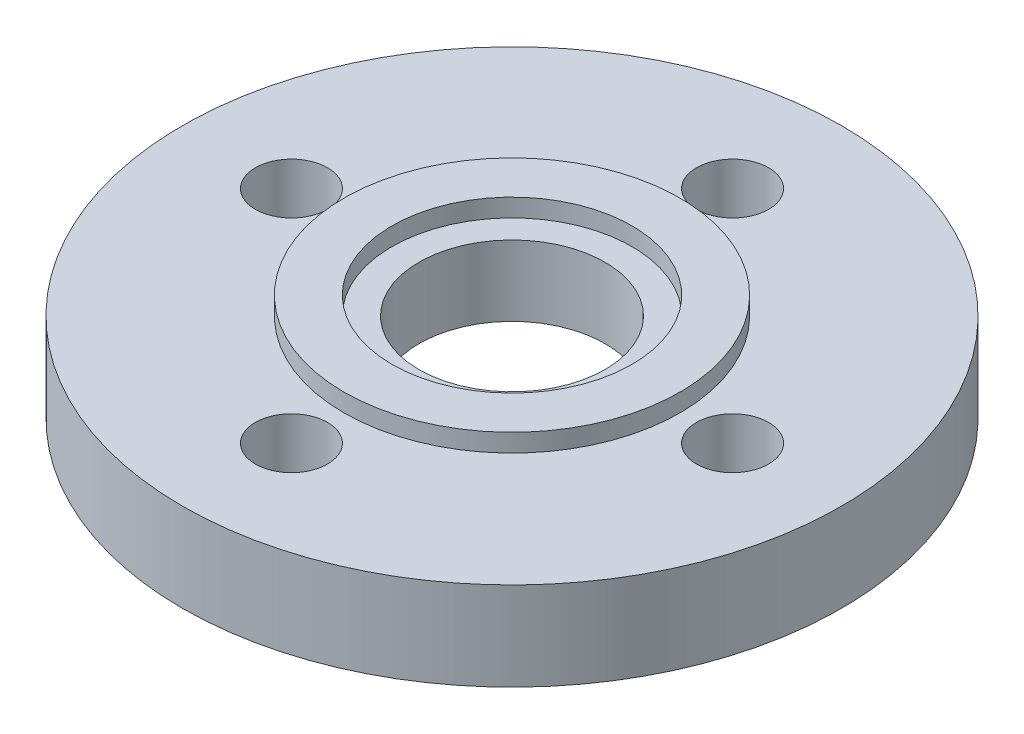
ISO-10303-21;
HEADER;
FILE_DESCRIPTION(('STEP AP214'),'2;1');
FILE_NAME('part.step','',(''),(''),'','','');
FILE_SCHEMA(('AUTOMOTIVE_DESIGN { 1 0 10303 214 1 1 1 1 }'));
ENDSEC;
DATA;
#1=APPLICATION_CONTEXT('core data for automotive mechanical design processes');
#2=APPLICATION_PROTOCOL_DEFINITION('international standard','automotive_design',2000,#1);
#3=PRODUCT_CONTEXT('',#1,'mechanical');
#4=PRODUCT('Part','Part','',(#3));
#5=PRODUCT_RELATED_PRODUCT_CATEGORY('part','',(#4));
#6=PRODUCT_DEFINITION_FORMATION('','',#4);
#7=PRODUCT_DEFINITION_CONTEXT('part definition',#1,'design');
#8=PRODUCT_DEFINITION('design','',#6,#7);
#9=PRODUCT_DEFINITION_SHAPE('','',#8);
#10=(LENGTH_UNIT() NAMED_UNIT(*) SI_UNIT(.MILLI.,.METRE.));
#11=(NAMED_UNIT(*) PLANE_ANGLE_UNIT() SI_UNIT($,.RADIAN.));
#12=(NAMED_UNIT(*) SI_UNIT($,.STERADIAN.) SOLID_ANGLE_UNIT());
#13=UNCERTAINTY_MEASURE_WITH_UNIT(LENGTH_MEASURE(1.E-05),#10,'distance_accuracy_value','');
#14=(GEOMETRIC_REPRESENTATION_CONTEXT(3) GLOBAL_UNCERTAINTY_ASSIGNED_CONTEXT((#13)) GLOBAL_UNIT_ASSIGNED_CONTEXT((#10,
#11,#12)) REPRESENTATION_CONTEXT('',''));
#15=CARTESIAN_POINT('',(0.,0.,0.));
#16=DIRECTION('',(0.,0.,1.));
#17=DIRECTION('',(1.,0.,0.));
#18=AXIS2_PLACEMENT_3D('',#15,#16,#17);
#19=CARTESIAN_POINT('',(0.,0.,0.));
#20=DIRECTION('',(0.,1.,0.));
#21=DIRECTION('',(0.,0.,1.));
#22=AXIS2_PLACEMENT_3D('',#19,#20,#21);
#23=CYLINDRICAL_SURFACE('',#22,3.1);
#24=CARTESIAN_POINT('',(0.,0.6,0.));
#25=DIRECTION('',(0.,1.,0.));
#26=DIRECTION('',(0.,0.,1.));
#27=AXIS2_PLACEMENT_3D('',#24,#25,#26);
#28=CIRCLE('',#27,3.1);
#29=CARTESIAN_POINT('',(0.,0.6,3.1));
#30=VERTEX_POINT('',#29);
#31=EDGE_CURVE('E150',#30,#30,#28,.T.);
#32=ORIENTED_EDGE('',*,*,#31,.F.);
#33=EDGE_LOOP('',(#32));
#34=FACE_BOUND('',#33,.T.);
#35=CARTESIAN_POINT('',(0.,2.95,0.));
#36=DIRECTION('',(0.,1.,0.));
#37=DIRECTION('',(0.,0.,1.));
#38=AXIS2_PLACEMENT_3D('',#35,#36,#37);
#39=CIRCLE('',#38,3.1);
#40=CARTESIAN_POINT('',(0.,2.95,3.1));
#41=VERTEX_POINT('',#40);
#42=EDGE_CURVE('E34',#41,#41,#39,.F.);
#43=ORIENTED_EDGE('',*,*,#42,.F.);
#44=EDGE_LOOP('',(#43));
#45=FACE_BOUND('',#44,.T.);
#46=ADVANCED_FACE('F30',(#34,#45),#23,.F.);
#47=CARTESIAN_POINT('',(0.,2.95,0.));
#48=DIRECTION('',(0.,-1.,0.));
#49=DIRECTION('',(0.,0.,-1.));
#50=AXIS2_PLACEMENT_3D('',#47,#48,#49);
#51=CYLINDRICAL_SURFACE('',#50,10.9823218589077);
#52=CARTESIAN_POINT('',(0.,2.95,0.));
#53=DIRECTION('',(0.,1.,0.));
#54=DIRECTION('',(0.,0.,1.));
#55=AXIS2_PLACEMENT_3D('',#52,#53,#54);
#56=CIRCLE('',#55,10.9823218589077);
#57=CARTESIAN_POINT('',(0.,2.95,10.9823218589077));
#58=VERTEX_POINT('',#57);
#59=EDGE_CURVE('E10',#58,#58,#56,.T.);
#60=ORIENTED_EDGE('',*,*,#59,.F.);
#61=EDGE_LOOP('',(#60));
#62=FACE_BOUND('',#61,.T.);
#63=CARTESIAN_POINT('',(0.,0.,0.));
#64=DIRECTION('',(0.,1.,0.));
#65=DIRECTION('',(0.,0.,1.));
#66=AXIS2_PLACEMENT_3D('',#63,#64,#65);
#67=CIRCLE('',#66,10.9823218589077);
#68=CARTESIAN_POINT('',(0.,0.,10.9823218589077));
#69=VERTEX_POINT('',#68);
#70=EDGE_CURVE('E38',#69,#69,#67,.T.);
#71=ORIENTED_EDGE('',*,*,#70,.T.);
#72=EDGE_LOOP('',(#71));
#73=FACE_BOUND('',#72,.T.);
#74=ADVANCED_FACE('F32',(#62,#73),#51,.T.);
#75=CARTESIAN_POINT('',(0.,2.95,0.));
#76=DIRECTION('',(0.,1.,0.));
#77=DIRECTION('',(0.,0.,1.));
#78=AXIS2_PLACEMENT_3D('',#75,#76,#77);
#79=PLANE('',#78);
#80=CARTESIAN_POINT('',(0.,2.95,0.));
#81=DIRECTION('',(0.,1.,0.));
#82=DIRECTION('',(0.,0.,1.));
#83=AXIS2_PLACEMENT_3D('',#80,#81,#82);
#84=CIRCLE('',#83,5.6);
#85=CARTESIAN_POINT('',(0.,2.95,5.6));
#86=VERTEX_POINT('',#85);
#87=EDGE_CURVE('E147',#86,#86,#84,.T.);
#88=ORIENTED_EDGE('',*,*,#87,.F.);
#89=EDGE_LOOP('',(#88));
#90=FACE_BOUND('',#89,.T.);
#91=CARTESIAN_POINT('',(7.35,2.95,0.));
#92=DIRECTION('',(0.,1.,0.));
#93=DIRECTION('',(0.,0.,1.));
#94=AXIS2_PLACEMENT_3D('',#91,#92,#93);
#95=CIRCLE('',#94,1.20282572740417);
#96=CARTESIAN_POINT('',(7.35,2.95,1.20282572740423));
#97=VERTEX_POINT('',#96);
#98=EDGE_CURVE('E53',#97,#97,#95,.T.);
#99=ORIENTED_EDGE('',*,*,#98,.F.);
#100=EDGE_LOOP('',(#99));
#101=FACE_BOUND('',#100,.T.);
#102=CARTESIAN_POINT('',(0.,2.95,7.35));
#103=DIRECTION('',(0.,1.,0.));
#104=DIRECTION('',(0.,0.,1.));
#105=AXIS2_PLACEMENT_3D('',#102,#103,#104);
#106=CIRCLE('',#105,1.20282572740417);
#107=CARTESIAN_POINT('',(0.,2.95,8.55282572740417));
#108=VERTEX_POINT('',#107);
#109=EDGE_CURVE('E135',#108,#108,#106,.T.);
#110=ORIENTED_EDGE('',*,*,#109,.F.);
#111=EDGE_LOOP('',(#110));
#112=FACE_BOUND('',#111,.T.);
#113=CARTESIAN_POINT('',(-7.35,2.95,0.));
#114=DIRECTION('',(0.,1.,0.));
#115=DIRECTION('',(0.,0.,1.));
#116=AXIS2_PLACEMENT_3D('',#113,#114,#115);
#117=CIRCLE('',#116,1.20282572740417);
#118=CARTESIAN_POINT('',(-7.35,2.95,1.20282572740417));
#119=VERTEX_POINT('',#118);
#120=EDGE_CURVE('E131',#119,#119,#117,.T.);
#121=ORIENTED_EDGE('',*,*,#120,.F.);
#122=EDGE_LOOP('',(#121));
#123=FACE_BOUND('',#122,.T.);
#124=CARTESIAN_POINT('',(0.,2.95,-7.35));
#125=DIRECTION('',(0.,1.,0.));
#126=DIRECTION('',(0.,0.,1.));
#127=AXIS2_PLACEMENT_3D('',#124,#125,#126);
#128=CIRCLE('',#127,1.20282572740417);
#129=CARTESIAN_POINT('',(0.,2.95,-6.14717427259582));
#130=VERTEX_POINT('',#129);
#131=EDGE_CURVE('E46',#130,#130,#128,.T.);
#132=ORIENTED_EDGE('',*,*,#131,.F.);
#133=EDGE_LOOP('',(#132));
#134=FACE_BOUND('',#133,.T.);
#135=ORIENTED_EDGE('',*,*,#59,.T.);
#136=EDGE_LOOP('',(#135));
#137=FACE_BOUND('',#136,.T.);
#138=ADVANCED_FACE('F67',(#90,#101,#112,#123,#134,#137),#79,.T.);
#139=CARTESIAN_POINT('',(0.,0.,0.));
#140=DIRECTION('',(0.,1.,0.));
#141=DIRECTION('',(0.,0.,1.));
#142=AXIS2_PLACEMENT_3D('',#139,#140,#141);
#143=PLANE('',#142);
#144=CARTESIAN_POINT('',(0.,0.,0.));
#145=DIRECTION('',(0.,1.,0.));
#146=DIRECTION('',(0.,0.,1.));
#147=AXIS2_PLACEMENT_3D('',#144,#145,#146);
#148=CIRCLE('',#147,4.95);
#149=CARTESIAN_POINT('',(0.,0.,4.95));
#150=VERTEX_POINT('',#149);
#151=EDGE_CURVE('E141',#150,#150,#148,.T.);
#152=ORIENTED_EDGE('',*,*,#151,.T.);
#153=EDGE_LOOP('',(#152));
#154=FACE_BOUND('',#153,.T.);
#155=CARTESIAN_POINT('',(7.35,0.,0.));
#156=DIRECTION('',(0.,1.,0.));
#157=DIRECTION('',(0.,0.,1.));
#158=AXIS2_PLACEMENT_3D('',#155,#156,#157);
#159=CIRCLE('',#158,1.20282572740417);
#160=CARTESIAN_POINT('',(7.35,0.,1.20282572740423));
#161=VERTEX_POINT('',#160);
#162=EDGE_CURVE('E43',#161,#161,#159,.F.);
#163=ORIENTED_EDGE('',*,*,#162,.F.);
#164=EDGE_LOOP('',(#163));
#165=FACE_BOUND('',#164,.T.);
#166=CARTESIAN_POINT('',(0.,0.,7.35));
#167=DIRECTION('',(0.,1.,0.));
#168=DIRECTION('',(0.,0.,1.));
#169=AXIS2_PLACEMENT_3D('',#166,#167,#168);
#170=CIRCLE('',#169,1.20282572740417);
#171=CARTESIAN_POINT('',(0.,0.,8.55282572740417));
#172=VERTEX_POINT('',#171);
#173=EDGE_CURVE('E56',#172,#172,#170,.F.);
#174=ORIENTED_EDGE('',*,*,#173,.F.);
#175=EDGE_LOOP('',(#174));
#176=FACE_BOUND('',#175,.T.);
#177=CARTESIAN_POINT('',(-7.35,0.,0.));
#178=DIRECTION('',(0.,1.,0.));
#179=DIRECTION('',(0.,0.,1.));
#180=AXIS2_PLACEMENT_3D('',#177,#178,#179);
#181=CIRCLE('',#180,1.20282572740417);
#182=CARTESIAN_POINT('',(-7.35,0.,1.20282572740417));
#183=VERTEX_POINT('',#182);
#184=EDGE_CURVE('E52',#183,#183,#181,.F.);
#185=ORIENTED_EDGE('',*,*,#184,.F.);
#186=EDGE_LOOP('',(#185));
#187=FACE_BOUND('',#186,.T.);
#188=CARTESIAN_POINT('',(0.,0.,-7.35));
#189=DIRECTION('',(0.,1.,0.));
#190=DIRECTION('',(0.,0.,1.));
#191=AXIS2_PLACEMENT_3D('',#188,#189,#190);
#192=CIRCLE('',#191,1.20282572740417);
#193=CARTESIAN_POINT('',(0.,0.,-6.14717427259582));
#194=VERTEX_POINT('',#193);
#195=EDGE_CURVE('E49',#194,#194,#192,.F.);
#196=ORIENTED_EDGE('',*,*,#195,.F.);
#197=EDGE_LOOP('',(#196));
#198=FACE_BOUND('',#197,.T.);
#199=ORIENTED_EDGE('',*,*,#70,.F.);
#200=EDGE_LOOP('',(#199));
#201=FACE_BOUND('',#200,.T.);
#202=ADVANCED_FACE('F63',(#154,#165,#176,#187,#198,#201),#143,.F.);
#203=CARTESIAN_POINT('',(0.,2.95,-7.35));
#204=DIRECTION('',(0.,-1.,0.));
#205=DIRECTION('',(0.,0.,-1.));
#206=AXIS2_PLACEMENT_3D('',#203,#204,#205);
#207=CYLINDRICAL_SURFACE('',#206,1.20282572740417);
#208=ORIENTED_EDGE('',*,*,#131,.T.);
#209=EDGE_LOOP('',(#208));
#210=FACE_BOUND('',#209,.T.);
#211=ORIENTED_EDGE('',*,*,#195,.T.);
#212=EDGE_LOOP('',(#211));
#213=FACE_BOUND('',#212,.T.);
#214=ADVANCED_FACE('F66',(#210,#213),#207,.F.);
#215=CARTESIAN_POINT('',(-7.35,2.95,0.));
#216=DIRECTION('',(0.,-1.,0.));
#217=DIRECTION('',(0.,0.,-1.));
#218=AXIS2_PLACEMENT_3D('',#215,#216,#217);
#219=CYLINDRICAL_SURFACE('',#218,1.20282572740417);
#220=ORIENTED_EDGE('',*,*,#120,.T.);
#221=EDGE_LOOP('',(#220));
#222=FACE_BOUND('',#221,.T.);
#223=ORIENTED_EDGE('',*,*,#184,.T.);
#224=EDGE_LOOP('',(#223));
#225=FACE_BOUND('',#224,.T.);
#226=ADVANCED_FACE('F116',(#222,#225),#219,.F.);
#227=CARTESIAN_POINT('',(0.,2.95,7.35));
#228=DIRECTION('',(0.,-1.,0.));
#229=DIRECTION('',(0.,0.,-1.));
#230=AXIS2_PLACEMENT_3D('',#227,#228,#229);
#231=CYLINDRICAL_SURFACE('',#230,1.20282572740417);
#232=ORIENTED_EDGE('',*,*,#109,.T.);
#233=EDGE_LOOP('',(#232));
#234=FACE_BOUND('',#233,.T.);
#235=ORIENTED_EDGE('',*,*,#173,.T.);
#236=EDGE_LOOP('',(#235));
#237=FACE_BOUND('',#236,.T.);
#238=ADVANCED_FACE('F114',(#234,#237),#231,.F.);
#239=CARTESIAN_POINT('',(7.35,2.95,0.));
#240=DIRECTION('',(0.,-1.,0.));
#241=DIRECTION('',(0.,0.,-1.));
#242=AXIS2_PLACEMENT_3D('',#239,#240,#241);
#243=CYLINDRICAL_SURFACE('',#242,1.20282572740417);
#244=ORIENTED_EDGE('',*,*,#98,.T.);
#245=EDGE_LOOP('',(#244));
#246=FACE_BOUND('',#245,.T.);
#247=ORIENTED_EDGE('',*,*,#162,.T.);
#248=EDGE_LOOP('',(#247));
#249=FACE_BOUND('',#248,.T.);
#250=ADVANCED_FACE('F61',(#246,#249),#243,.F.);
#251=CARTESIAN_POINT('',(0.,0.6,0.));
#252=DIRECTION('',(0.,-1.,0.));
#253=DIRECTION('',(0.,0.,-1.));
#254=AXIS2_PLACEMENT_3D('',#251,#252,#253);
#255=CYLINDRICAL_SURFACE('',#254,4.95);
#256=CARTESIAN_POINT('',(0.,0.6,0.));
#257=DIRECTION('',(0.,1.,0.));
#258=DIRECTION('',(0.,0.,1.));
#259=AXIS2_PLACEMENT_3D('',#256,#257,#258);
#260=CIRCLE('',#259,4.95);
#261=CARTESIAN_POINT('',(0.,0.6,4.95));
#262=VERTEX_POINT('',#261);
#263=EDGE_CURVE('E139',#262,#262,#260,.T.);
#264=ORIENTED_EDGE('',*,*,#263,.T.);
#265=EDGE_LOOP('',(#264));
#266=FACE_BOUND('',#265,.T.);
#267=ORIENTED_EDGE('',*,*,#151,.F.);
#268=EDGE_LOOP('',(#267));
#269=FACE_BOUND('',#268,.T.);
#270=ADVANCED_FACE('F107',(#266,#269),#255,.F.);
#271=CARTESIAN_POINT('',(0.,0.6,0.));
#272=DIRECTION('',(0.,1.,0.));
#273=DIRECTION('',(0.,0.,1.));
#274=AXIS2_PLACEMENT_3D('',#271,#272,#273);
#275=PLANE('',#274);
#276=ORIENTED_EDGE('',*,*,#31,.T.);
#277=EDGE_LOOP('',(#276));
#278=FACE_BOUND('',#277,.T.);
#279=ORIENTED_EDGE('',*,*,#263,.F.);
#280=EDGE_LOOP('',(#279));
#281=FACE_BOUND('',#280,.T.);
#282=ADVANCED_FACE('F103',(#278,#281),#275,.F.);
#283=CARTESIAN_POINT('',(0.,3.55,0.));
#284=DIRECTION('',(0.,-1.,0.));
#285=DIRECTION('',(0.,0.,-1.));
#286=AXIS2_PLACEMENT_3D('',#283,#284,#285);
#287=CYLINDRICAL_SURFACE('',#286,5.6);
#288=CARTESIAN_POINT('',(0.,3.55,0.));
#289=DIRECTION('',(0.,1.,0.));
#290=DIRECTION('',(0.,0.,1.));
#291=AXIS2_PLACEMENT_3D('',#288,#289,#290);
#292=CIRCLE('',#291,5.6);
#293=CARTESIAN_POINT('',(0.,3.55,5.6));
#294=VERTEX_POINT('',#293);
#295=EDGE_CURVE('E144',#294,#294,#292,.T.);
#296=ORIENTED_EDGE('',*,*,#295,.F.);
#297=EDGE_LOOP('',(#296));
#298=FACE_BOUND('',#297,.T.);
#299=ORIENTED_EDGE('',*,*,#87,.T.);
#300=EDGE_LOOP('',(#299));
#301=FACE_BOUND('',#300,.T.);
#302=ADVANCED_FACE('F99',(#298,#301),#287,.T.);
#303=CARTESIAN_POINT('',(0.,3.55,0.));
#304=DIRECTION('',(0.,1.,0.));
#305=DIRECTION('',(0.,0.,1.));
#306=AXIS2_PLACEMENT_3D('',#303,#304,#305);
#307=PLANE('',#306);
#308=CARTESIAN_POINT('',(0.,3.55,0.));
#309=DIRECTION('',(0.,1.,0.));
#310=DIRECTION('',(0.,0.,1.));
#311=AXIS2_PLACEMENT_3D('',#308,#309,#310);
#312=CIRCLE('',#311,4.);
#313=CARTESIAN_POINT('',(0.,3.55,4.));
#314=VERTEX_POINT('',#313);
#315=EDGE_CURVE('E155',#314,#314,#312,.T.);
#316=ORIENTED_EDGE('',*,*,#315,.F.);
#317=EDGE_LOOP('',(#316));
#318=FACE_BOUND('',#317,.T.);
#319=ORIENTED_EDGE('',*,*,#295,.T.);
#320=EDGE_LOOP('',(#319));
#321=FACE_BOUND('',#320,.T.);
#322=ADVANCED_FACE('F95',(#318,#321),#307,.T.);
#323=CARTESIAN_POINT('',(0.,2.95,0.));
#324=DIRECTION('',(0.,1.,0.));
#325=DIRECTION('',(0.,0.,1.));
#326=AXIS2_PLACEMENT_3D('',#323,#324,#325);
#327=PLANE('',#326);
#328=CARTESIAN_POINT('',(0.,2.95,0.));
#329=DIRECTION('',(0.,1.,0.));
#330=DIRECTION('',(0.,0.,1.));
#331=AXIS2_PLACEMENT_3D('',#328,#329,#330);
#332=CIRCLE('',#331,4.);
#333=CARTESIAN_POINT('',(0.,2.95,4.));
#334=VERTEX_POINT('',#333);
#335=EDGE_CURVE('E158',#334,#334,#332,.T.);
#336=ORIENTED_EDGE('',*,*,#335,.T.);
#337=EDGE_LOOP('',(#336));
#338=FACE_BOUND('',#337,.T.);
#339=ORIENTED_EDGE('',*,*,#42,.T.);
#340=EDGE_LOOP('',(#339));
#341=FACE_BOUND('',#340,.T.);
#342=ADVANCED_FACE('F98',(#338,#341),#327,.T.);
#343=CARTESIAN_POINT('',(0.,2.95,0.));
#344=DIRECTION('',(0.,1.,0.));
#345=DIRECTION('',(0.,0.,1.));
#346=AXIS2_PLACEMENT_3D('',#343,#344,#345);
#347=CYLINDRICAL_SURFACE('',#346,4.);
#348=ORIENTED_EDGE('',*,*,#335,.F.);
#349=EDGE_LOOP('',(#348));
#350=FACE_BOUND('',#349,.T.);
#351=ORIENTED_EDGE('',*,*,#315,.T.);
#352=EDGE_LOOP('',(#351));
#353=FACE_BOUND('',#352,.T.);
#354=ADVANCED_FACE('F93',(#350,#353),#347,.F.);
#355=CLOSED_SHELL('',(#46,#74,#138,#202,#214,#226,#238,#250,#270,#282,#302,#322,#342,#354));
#356=MANIFOLD_SOLID_BREP('B2',#355);
#357=ADVANCED_BREP_SHAPE_REPRESENTATION('',(#18,#356),#14);
#358=SHAPE_DEFINITION_REPRESENTATION(#9,#357);
ENDSEC;
END-ISO-10303-21;
